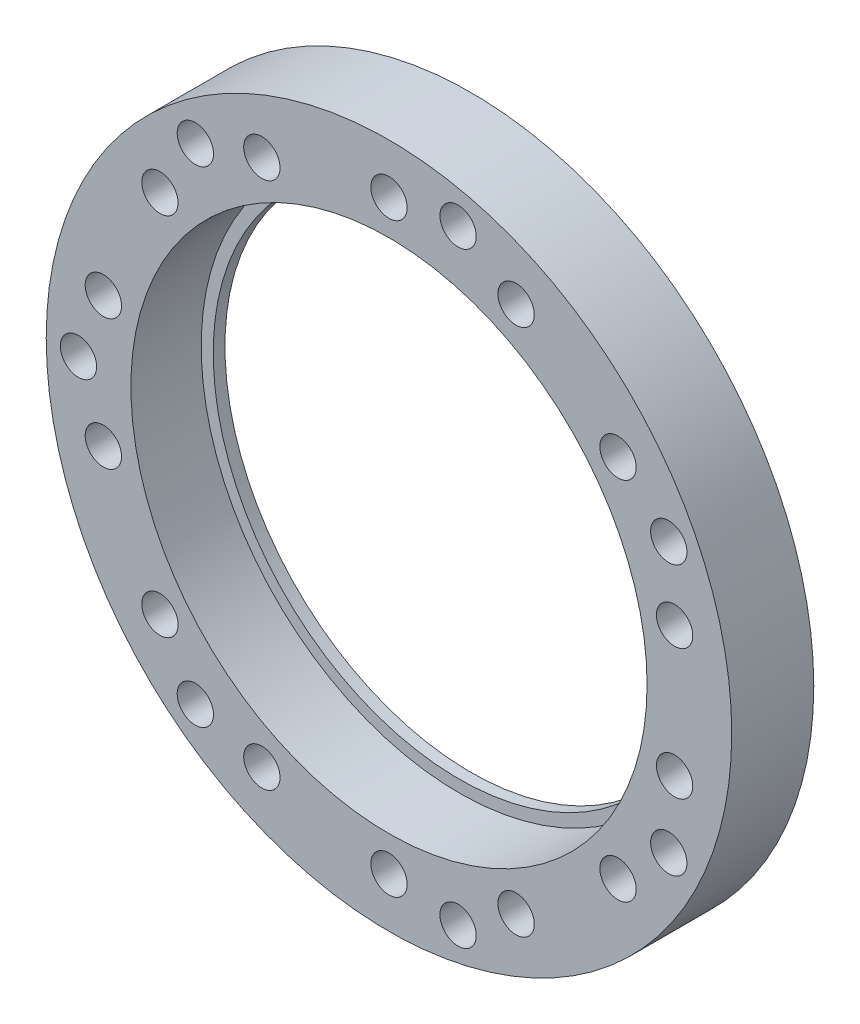
ISO-10303-21;
HEADER;
FILE_DESCRIPTION(('STEP AP214'),'2;1');
FILE_NAME('part.step','',(''),(''),'','','');
FILE_SCHEMA(('AUTOMOTIVE_DESIGN { 1 0 10303 214 1 1 1 1 }'));
ENDSEC;
DATA;
#1=APPLICATION_CONTEXT('core data for automotive mechanical design processes');
#2=APPLICATION_PROTOCOL_DEFINITION('international standard','automotive_design',2000,#1);
#3=PRODUCT_CONTEXT('',#1,'mechanical');
#4=PRODUCT('Part','Part','',(#3));
#5=PRODUCT_RELATED_PRODUCT_CATEGORY('part','',(#4));
#6=PRODUCT_DEFINITION_FORMATION('','',#4);
#7=PRODUCT_DEFINITION_CONTEXT('part definition',#1,'design');
#8=PRODUCT_DEFINITION('design','',#6,#7);
#9=PRODUCT_DEFINITION_SHAPE('','',#8);
#10=(LENGTH_UNIT() NAMED_UNIT(*) SI_UNIT(.MILLI.,.METRE.));
#11=(NAMED_UNIT(*) PLANE_ANGLE_UNIT() SI_UNIT($,.RADIAN.));
#12=(NAMED_UNIT(*) SI_UNIT($,.STERADIAN.) SOLID_ANGLE_UNIT());
#13=UNCERTAINTY_MEASURE_WITH_UNIT(LENGTH_MEASURE(1.E-05),#10,'distance_accuracy_value','');
#14=(GEOMETRIC_REPRESENTATION_CONTEXT(3) GLOBAL_UNCERTAINTY_ASSIGNED_CONTEXT((#13)) GLOBAL_UNIT_ASSIGNED_CONTEXT((#10,
#11,#12)) REPRESENTATION_CONTEXT('',''));
#15=CARTESIAN_POINT('',(0.,0.,0.));
#16=DIRECTION('',(0.,0.,1.));
#17=DIRECTION('',(1.,0.,0.));
#18=AXIS2_PLACEMENT_3D('',#15,#16,#17);
#19=CARTESIAN_POINT('',(0.,0.,7.));
#20=DIRECTION('',(0.,0.,-1.));
#21=DIRECTION('',(-1.,0.,0.));
#22=AXIS2_PLACEMENT_3D('',#19,#20,#21);
#23=CYLINDRICAL_SURFACE('',#22,29.25);
#24=CARTESIAN_POINT('',(0.,0.,7.));
#25=DIRECTION('',(0.,0.,1.));
#26=DIRECTION('',(1.,0.,0.));
#27=AXIS2_PLACEMENT_3D('',#24,#25,#26);
#28=CIRCLE('',#27,29.25);
#29=CARTESIAN_POINT('',(29.25,0.,7.));
#30=VERTEX_POINT('',#29);
#31=EDGE_CURVE('E57',#30,#30,#28,.T.);
#32=ORIENTED_EDGE('',*,*,#31,.F.);
#33=EDGE_LOOP('',(#32));
#34=FACE_BOUND('',#33,.T.);
#35=CARTESIAN_POINT('',(0.,0.,0.));
#36=DIRECTION('',(0.,0.,1.));
#37=DIRECTION('',(1.,0.,0.));
#38=AXIS2_PLACEMENT_3D('',#35,#36,#37);
#39=CIRCLE('',#38,29.25);
#40=CARTESIAN_POINT('',(29.25,0.,0.));
#41=VERTEX_POINT('',#40);
#42=EDGE_CURVE('E65',#41,#41,#39,.T.);
#43=ORIENTED_EDGE('',*,*,#42,.T.);
#44=EDGE_LOOP('',(#43));
#45=FACE_BOUND('',#44,.T.);
#46=ADVANCED_FACE('F43',(#34,#45),#23,.T.);
#47=CARTESIAN_POINT('',(0.,0.,7.));
#48=DIRECTION('',(0.,0.,-1.));
#49=DIRECTION('',(-1.,0.,0.));
#50=AXIS2_PLACEMENT_3D('',#47,#48,#49);
#51=CYLINDRICAL_SURFACE('',#50,22.025);
#52=CARTESIAN_POINT('',(0.,0.,1.));
#53=DIRECTION('',(0.,0.,1.));
#54=DIRECTION('',(1.,0.,0.));
#55=AXIS2_PLACEMENT_3D('',#52,#53,#54);
#56=CIRCLE('',#55,22.025);
#57=CARTESIAN_POINT('',(22.025,0.,1.));
#58=VERTEX_POINT('',#57);
#59=EDGE_CURVE('E10',#58,#58,#56,.T.);
#60=ORIENTED_EDGE('',*,*,#59,.F.);
#61=EDGE_LOOP('',(#60));
#62=FACE_BOUND('',#61,.T.);
#63=CARTESIAN_POINT('',(0.,0.,7.));
#64=DIRECTION('',(0.,0.,1.));
#65=DIRECTION('',(1.,0.,0.));
#66=AXIS2_PLACEMENT_3D('',#63,#64,#65);
#67=CIRCLE('',#66,22.025);
#68=CARTESIAN_POINT('',(22.025,0.,7.));
#69=VERTEX_POINT('',#68);
#70=EDGE_CURVE('E50',#69,#69,#67,.T.);
#71=ORIENTED_EDGE('',*,*,#70,.T.);
#72=EDGE_LOOP('',(#71));
#73=FACE_BOUND('',#72,.T.);
#74=ADVANCED_FACE('F264',(#62,#73),#51,.F.);
#75=CARTESIAN_POINT('',(0.,0.,7.));
#76=DIRECTION('',(0.,0.,1.));
#77=DIRECTION('',(1.,0.,0.));
#78=AXIS2_PLACEMENT_3D('',#75,#76,#77);
#79=PLANE('',#78);
#80=CARTESIAN_POINT('',(5.89680474984235,25.8355896728183,7.));
#81=DIRECTION('',(0.,0.,1.));
#82=DIRECTION('',(1.,0.,0.));
#83=AXIS2_PLACEMENT_3D('',#80,#81,#82);
#84=CIRCLE('',#83,1.55);
#85=CARTESIAN_POINT('',(7.44680474984235,25.8355896728183,7.));
#86=VERTEX_POINT('',#85);
#87=EDGE_CURVE('E203',#86,#86,#84,.T.);
#88=ORIENTED_EDGE('',*,*,#87,.F.);
#89=EDGE_LOOP('',(#88));
#90=FACE_BOUND('',#89,.T.);
#91=CARTESIAN_POINT('',(-16.5224797492562,20.7185342854018,7.));
#92=DIRECTION('',(0.,0.,1.));
#93=DIRECTION('',(1.,0.,0.));
#94=AXIS2_PLACEMENT_3D('',#91,#92,#93);
#95=CIRCLE('',#94,1.55);
#96=CARTESIAN_POINT('',(-14.9724797492562,20.7185342854018,7.));
#97=VERTEX_POINT('',#96);
#98=EDGE_CURVE('E228',#97,#97,#95,.T.);
#99=ORIENTED_EDGE('',*,*,#98,.F.);
#100=EDGE_LOOP('',(#99));
#101=FACE_BOUND('',#100,.T.);
#102=CARTESIAN_POINT('',(-26.4999999999989,-1.34180860866806E-12,7.));
#103=DIRECTION('',(0.,0.,1.));
#104=DIRECTION('',(1.,0.,0.));
#105=AXIS2_PLACEMENT_3D('',#102,#103,#104);
#106=CIRCLE('',#105,1.55);
#107=CARTESIAN_POINT('',(-24.9499999999989,-1.34180860866806E-12,7.));
#108=VERTEX_POINT('',#107);
#109=EDGE_CURVE('E220',#108,#108,#106,.T.);
#110=ORIENTED_EDGE('',*,*,#109,.F.);
#111=EDGE_LOOP('',(#110));
#112=FACE_BOUND('',#111,.T.);
#113=CARTESIAN_POINT('',(-16.5224797492544,-20.7185342854037,7.));
#114=DIRECTION('',(0.,0.,1.));
#115=DIRECTION('',(1.,0.,0.));
#116=AXIS2_PLACEMENT_3D('',#113,#114,#115);
#117=CIRCLE('',#116,1.55);
#118=CARTESIAN_POINT('',(-14.9724797492544,-20.7185342854037,7.));
#119=VERTEX_POINT('',#118);
#120=EDGE_CURVE('E211',#119,#119,#117,.T.);
#121=ORIENTED_EDGE('',*,*,#120,.F.);
#122=EDGE_LOOP('',(#121));
#123=FACE_BOUND('',#122,.T.);
#124=CARTESIAN_POINT('',(5.89680474984452,-25.8355896728183,7.));
#125=DIRECTION('',(0.,0.,1.));
#126=DIRECTION('',(1.,0.,0.));
#127=AXIS2_PLACEMENT_3D('',#124,#125,#126);
#128=CIRCLE('',#127,1.55);
#129=CARTESIAN_POINT('',(7.44680474984452,-25.8355896728183,7.));
#130=VERTEX_POINT('',#129);
#131=EDGE_CURVE('E212',#130,#130,#128,.T.);
#132=ORIENTED_EDGE('',*,*,#131,.F.);
#133=EDGE_LOOP('',(#132));
#134=FACE_BOUND('',#133,.T.);
#135=CARTESIAN_POINT('',(23.8756749994157,-11.4979190866145,7.));
#136=DIRECTION('',(0.,0.,1.));
#137=DIRECTION('',(1.,0.,0.));
#138=AXIS2_PLACEMENT_3D('',#135,#136,#137);
#139=CIRCLE('',#138,1.55);
#140=CARTESIAN_POINT('',(25.4256749994157,-11.4979190866145,7.));
#141=VERTEX_POINT('',#140);
#142=EDGE_CURVE('E243',#141,#141,#139,.T.);
#143=ORIENTED_EDGE('',*,*,#142,.F.);
#144=EDGE_LOOP('',(#143));
#145=FACE_BOUND('',#144,.T.);
#146=CARTESIAN_POINT('',(23.8756749994147,11.4979190866161,7.));
#147=DIRECTION('',(0.,0.,1.));
#148=DIRECTION('',(1.,0.,0.));
#149=AXIS2_PLACEMENT_3D('',#146,#147,#148);
#150=CIRCLE('',#149,1.55);
#151=CARTESIAN_POINT('',(25.4256749994147,11.4979190866161,7.));
#152=VERTEX_POINT('',#151);
#153=EDGE_CURVE('E195',#152,#152,#150,.T.);
#154=ORIENTED_EDGE('',*,*,#153,.F.);
#155=EDGE_LOOP('',(#154));
#156=FACE_BOUND('',#155,.T.);
#157=CARTESIAN_POINT('',(10.8470934779392,22.5242216975604,7.));
#158=DIRECTION('',(0.,0.,1.));
#159=DIRECTION('',(1.,0.,0.));
#160=AXIS2_PLACEMENT_3D('',#157,#158,#159);
#161=CIRCLE('',#160,1.55);
#162=CARTESIAN_POINT('',(12.3970934779392,22.5242216975604,7.));
#163=VERTEX_POINT('',#162);
#164=EDGE_CURVE('E144',#163,#163,#161,.T.);
#165=ORIENTED_EDGE('',*,*,#164,.F.);
#166=EDGE_LOOP('',(#165));
#167=FACE_BOUND('',#166,.T.);
#168=CARTESIAN_POINT('',(19.5457870617014,15.5872450464687,7.));
#169=DIRECTION('',(0.,0.,1.));
#170=DIRECTION('',(1.,0.,0.));
#171=AXIS2_PLACEMENT_3D('',#168,#169,#170);
#172=CIRCLE('',#171,1.55);
#173=CARTESIAN_POINT('',(21.0957870617014,15.5872450464687,7.));
#174=VERTEX_POINT('',#173);
#175=EDGE_CURVE('E136',#174,#174,#172,.T.);
#176=ORIENTED_EDGE('',*,*,#175,.F.);
#177=EDGE_LOOP('',(#176));
#178=FACE_BOUND('',#177,.T.);
#179=CARTESIAN_POINT('',(24.3731978045465,5.56302334890829,7.));
#180=DIRECTION('',(0.,0.,1.));
#181=DIRECTION('',(1.,0.,0.));
#182=AXIS2_PLACEMENT_3D('',#179,#180,#181);
#183=CIRCLE('',#182,1.55);
#184=CARTESIAN_POINT('',(25.9231978045465,5.56302334890829,7.));
#185=VERTEX_POINT('',#184);
#186=EDGE_CURVE('E128',#185,#185,#183,.T.);
#187=ORIENTED_EDGE('',*,*,#186,.F.);
#188=EDGE_LOOP('',(#187));
#189=FACE_BOUND('',#188,.T.);
#190=CARTESIAN_POINT('',(24.3731978045468,-5.5630233489075,7.));
#191=DIRECTION('',(0.,0.,1.));
#192=DIRECTION('',(1.,0.,0.));
#193=AXIS2_PLACEMENT_3D('',#190,#191,#192);
#194=CIRCLE('',#193,1.55);
#195=CARTESIAN_POINT('',(25.9231978045468,-5.5630233489075,7.));
#196=VERTEX_POINT('',#195);
#197=EDGE_CURVE('E120',#196,#196,#194,.T.);
#198=ORIENTED_EDGE('',*,*,#197,.F.);
#199=EDGE_LOOP('',(#198));
#200=FACE_BOUND('',#199,.T.);
#201=CARTESIAN_POINT('',(19.5457870617021,-15.5872450464682,7.));
#202=DIRECTION('',(0.,0.,1.));
#203=DIRECTION('',(1.,0.,0.));
#204=AXIS2_PLACEMENT_3D('',#201,#202,#203);
#205=CIRCLE('',#204,1.55);
#206=CARTESIAN_POINT('',(21.0957870617021,-15.5872450464682,7.));
#207=VERTEX_POINT('',#206);
#208=EDGE_CURVE('E112',#207,#207,#205,.T.);
#209=ORIENTED_EDGE('',*,*,#208,.F.);
#210=EDGE_LOOP('',(#209));
#211=FACE_BOUND('',#210,.T.);
#212=CARTESIAN_POINT('',(10.8470934779405,-22.5242216975606,7.));
#213=DIRECTION('',(0.,0.,1.));
#214=DIRECTION('',(1.,0.,0.));
#215=AXIS2_PLACEMENT_3D('',#212,#213,#214);
#216=CIRCLE('',#215,1.55);
#217=CARTESIAN_POINT('',(12.3970934779405,-22.5242216975606,7.));
#218=VERTEX_POINT('',#217);
#219=EDGE_CURVE('E104',#218,#218,#216,.T.);
#220=ORIENTED_EDGE('',*,*,#219,.F.);
#221=EDGE_LOOP('',(#220));
#222=FACE_BOUND('',#221,.T.);
#223=CARTESIAN_POINT('',(1.51614831800373E-12,-25.0000000000004,7.));
#224=DIRECTION('',(0.,0.,1.));
#225=DIRECTION('',(1.,0.,0.));
#226=AXIS2_PLACEMENT_3D('',#223,#224,#225);
#227=CIRCLE('',#226,1.55);
#228=CARTESIAN_POINT('',(1.55000000000152,-25.0000000000004,7.));
#229=VERTEX_POINT('',#228);
#230=EDGE_CURVE('E96',#229,#229,#227,.T.);
#231=ORIENTED_EDGE('',*,*,#230,.F.);
#232=EDGE_LOOP('',(#231));
#233=FACE_BOUND('',#232,.T.);
#234=CARTESIAN_POINT('',(-10.8470934779375,-22.5242216975612,7.));
#235=DIRECTION('',(0.,0.,1.));
#236=DIRECTION('',(1.,0.,0.));
#237=AXIS2_PLACEMENT_3D('',#234,#235,#236);
#238=CIRCLE('',#237,1.55);
#239=CARTESIAN_POINT('',(-9.29709347793754,-22.5242216975612,7.));
#240=VERTEX_POINT('',#239);
#241=EDGE_CURVE('E87',#240,#240,#238,.T.);
#242=ORIENTED_EDGE('',*,*,#241,.F.);
#243=EDGE_LOOP('',(#242));
#244=FACE_BOUND('',#243,.T.);
#245=CARTESIAN_POINT('',(-19.5457870616993,-15.5872450464695,7.));
#246=DIRECTION('',(0.,0.,1.));
#247=DIRECTION('',(1.,0.,0.));
#248=AXIS2_PLACEMENT_3D('',#245,#246,#247);
#249=CIRCLE('',#248,1.55);
#250=CARTESIAN_POINT('',(-17.9957870616993,-15.5872450464695,7.));
#251=VERTEX_POINT('',#250);
#252=EDGE_CURVE('E184',#251,#251,#249,.T.);
#253=ORIENTED_EDGE('',*,*,#252,.F.);
#254=EDGE_LOOP('',(#253));
#255=FACE_BOUND('',#254,.T.);
#256=CARTESIAN_POINT('',(-24.3731978045445,-5.56302334890922,7.));
#257=DIRECTION('',(0.,0.,1.));
#258=DIRECTION('',(1.,0.,0.));
#259=AXIS2_PLACEMENT_3D('',#256,#257,#258);
#260=CIRCLE('',#259,1.55);
#261=CARTESIAN_POINT('',(-22.8231978045445,-5.56302334890922,7.));
#262=VERTEX_POINT('',#261);
#263=EDGE_CURVE('E176',#262,#262,#260,.T.);
#264=ORIENTED_EDGE('',*,*,#263,.F.);
#265=EDGE_LOOP('',(#264));
#266=FACE_BOUND('',#265,.T.);
#267=CARTESIAN_POINT('',(-24.3731978045449,5.56302334890648,7.));
#268=DIRECTION('',(0.,0.,1.));
#269=DIRECTION('',(1.,0.,0.));
#270=AXIS2_PLACEMENT_3D('',#267,#268,#269);
#271=CIRCLE('',#270,1.55);
#272=CARTESIAN_POINT('',(-22.8231978045449,5.56302334890648,7.));
#273=VERTEX_POINT('',#272);
#274=EDGE_CURVE('E168',#273,#273,#271,.T.);
#275=ORIENTED_EDGE('',*,*,#274,.F.);
#276=EDGE_LOOP('',(#275));
#277=FACE_BOUND('',#276,.T.);
#278=CARTESIAN_POINT('',(-19.5457870617004,15.5872450464671,7.));
#279=DIRECTION('',(0.,0.,1.));
#280=DIRECTION('',(1.,0.,0.));
#281=AXIS2_PLACEMENT_3D('',#278,#279,#280);
#282=CIRCLE('',#281,1.55);
#283=CARTESIAN_POINT('',(-17.9957870617004,15.5872450464671,7.));
#284=VERTEX_POINT('',#283);
#285=EDGE_CURVE('E160',#284,#284,#282,.T.);
#286=ORIENTED_EDGE('',*,*,#285,.F.);
#287=EDGE_LOOP('',(#286));
#288=FACE_BOUND('',#287,.T.);
#289=CARTESIAN_POINT('',(-10.8470934779388,22.5242216975595,7.));
#290=DIRECTION('',(0.,0.,1.));
#291=DIRECTION('',(1.,0.,0.));
#292=AXIS2_PLACEMENT_3D('',#289,#290,#291);
#293=CIRCLE('',#292,1.55);
#294=CARTESIAN_POINT('',(-9.29709347793884,22.5242216975595,7.));
#295=VERTEX_POINT('',#294);
#296=EDGE_CURVE('E151',#295,#295,#293,.T.);
#297=ORIENTED_EDGE('',*,*,#296,.F.);
#298=EDGE_LOOP('',(#297));
#299=FACE_BOUND('',#298,.T.);
#300=CARTESIAN_POINT('',(0.,25.,7.));
#301=DIRECTION('',(0.,0.,1.));
#302=DIRECTION('',(1.,0.,0.));
#303=AXIS2_PLACEMENT_3D('',#300,#301,#302);
#304=CIRCLE('',#303,1.55);
#305=CARTESIAN_POINT('',(1.55,25.,7.));
#306=VERTEX_POINT('',#305);
#307=EDGE_CURVE('E77',#306,#306,#304,.T.);
#308=ORIENTED_EDGE('',*,*,#307,.F.);
#309=EDGE_LOOP('',(#308));
#310=FACE_BOUND('',#309,.T.);
#311=ORIENTED_EDGE('',*,*,#31,.T.);
#312=EDGE_LOOP('',(#311));
#313=FACE_BOUND('',#312,.T.);
#314=ORIENTED_EDGE('',*,*,#70,.F.);
#315=EDGE_LOOP('',(#314));
#316=FACE_BOUND('',#315,.T.);
#317=ADVANCED_FACE('F260',(#90,#101,#112,#123,#134,#145,#156,#167,#178,#189,#200,#211,#222,#233,
#244,#255,#266,#277,#288,#299,#310,#313,#316),#79,.T.);
#318=CARTESIAN_POINT('',(0.,0.,0.));
#319=DIRECTION('',(0.,0.,1.));
#320=DIRECTION('',(1.,0.,0.));
#321=AXIS2_PLACEMENT_3D('',#318,#319,#320);
#322=PLANE('',#321);
#323=CARTESIAN_POINT('',(5.89680474984235,25.8355896728183,0.));
#324=DIRECTION('',(0.,0.,1.));
#325=DIRECTION('',(1.,0.,0.));
#326=AXIS2_PLACEMENT_3D('',#323,#324,#325);
#327=CIRCLE('',#326,1.55);
#328=CARTESIAN_POINT('',(7.44680474984235,25.8355896728183,0.));
#329=VERTEX_POINT('',#328);
#330=EDGE_CURVE('E232',#329,#329,#327,.T.);
#331=ORIENTED_EDGE('',*,*,#330,.T.);
#332=EDGE_LOOP('',(#331));
#333=FACE_BOUND('',#332,.T.);
#334=CARTESIAN_POINT('',(-16.5224797492562,20.7185342854018,0.));
#335=DIRECTION('',(0.,0.,1.));
#336=DIRECTION('',(1.,0.,0.));
#337=AXIS2_PLACEMENT_3D('',#334,#335,#336);
#338=CIRCLE('',#337,1.55);
#339=CARTESIAN_POINT('',(-14.9724797492562,20.7185342854018,0.));
#340=VERTEX_POINT('',#339);
#341=EDGE_CURVE('E224',#340,#340,#338,.T.);
#342=ORIENTED_EDGE('',*,*,#341,.T.);
#343=EDGE_LOOP('',(#342));
#344=FACE_BOUND('',#343,.T.);
#345=CARTESIAN_POINT('',(-26.4999999999989,-1.34180860866806E-12,0.));
#346=DIRECTION('',(0.,0.,1.));
#347=DIRECTION('',(1.,0.,0.));
#348=AXIS2_PLACEMENT_3D('',#345,#346,#347);
#349=CIRCLE('',#348,1.55);
#350=CARTESIAN_POINT('',(-24.9499999999989,-1.34180860866806E-12,0.));
#351=VERTEX_POINT('',#350);
#352=EDGE_CURVE('E216',#351,#351,#349,.T.);
#353=ORIENTED_EDGE('',*,*,#352,.T.);
#354=EDGE_LOOP('',(#353));
#355=FACE_BOUND('',#354,.T.);
#356=CARTESIAN_POINT('',(-16.5224797492544,-20.7185342854037,0.));
#357=DIRECTION('',(0.,0.,1.));
#358=DIRECTION('',(1.,0.,0.));
#359=AXIS2_PLACEMENT_3D('',#356,#357,#358);
#360=CIRCLE('',#359,1.55);
#361=CARTESIAN_POINT('',(-14.9724797492544,-20.7185342854037,0.));
#362=VERTEX_POINT('',#361);
#363=EDGE_CURVE('E207',#362,#362,#360,.T.);
#364=ORIENTED_EDGE('',*,*,#363,.T.);
#365=EDGE_LOOP('',(#364));
#366=FACE_BOUND('',#365,.T.);
#367=CARTESIAN_POINT('',(5.89680474984452,-25.8355896728183,0.));
#368=DIRECTION('',(0.,0.,1.));
#369=DIRECTION('',(1.,0.,0.));
#370=AXIS2_PLACEMENT_3D('',#367,#368,#369);
#371=CIRCLE('',#370,1.55);
#372=CARTESIAN_POINT('',(7.44680474984452,-25.8355896728183,0.));
#373=VERTEX_POINT('',#372);
#374=EDGE_CURVE('E247',#373,#373,#371,.T.);
#375=ORIENTED_EDGE('',*,*,#374,.T.);
#376=EDGE_LOOP('',(#375));
#377=FACE_BOUND('',#376,.T.);
#378=CARTESIAN_POINT('',(23.8756749994157,-11.4979190866145,0.));
#379=DIRECTION('',(0.,0.,1.));
#380=DIRECTION('',(1.,0.,0.));
#381=AXIS2_PLACEMENT_3D('',#378,#379,#380);
#382=CIRCLE('',#381,1.55);
#383=CARTESIAN_POINT('',(25.4256749994157,-11.4979190866145,0.));
#384=VERTEX_POINT('',#383);
#385=EDGE_CURVE('E239',#384,#384,#382,.T.);
#386=ORIENTED_EDGE('',*,*,#385,.T.);
#387=EDGE_LOOP('',(#386));
#388=FACE_BOUND('',#387,.T.);
#389=CARTESIAN_POINT('',(23.8756749994147,11.4979190866161,0.));
#390=DIRECTION('',(0.,0.,1.));
#391=DIRECTION('',(1.,0.,0.));
#392=AXIS2_PLACEMENT_3D('',#389,#390,#391);
#393=CIRCLE('',#392,1.55);
#394=CARTESIAN_POINT('',(25.4256749994147,11.4979190866161,0.));
#395=VERTEX_POINT('',#394);
#396=EDGE_CURVE('E199',#395,#395,#393,.T.);
#397=ORIENTED_EDGE('',*,*,#396,.T.);
#398=EDGE_LOOP('',(#397));
#399=FACE_BOUND('',#398,.T.);
#400=ORIENTED_EDGE('',*,*,#42,.F.);
#401=EDGE_LOOP('',(#400));
#402=FACE_BOUND('',#401,.T.);
#403=CARTESIAN_POINT('',(0.,0.,0.));
#404=DIRECTION('',(0.,0.,1.));
#405=DIRECTION('',(1.,0.,0.));
#406=AXIS2_PLACEMENT_3D('',#403,#404,#405);
#407=CIRCLE('',#406,21.);
#408=CARTESIAN_POINT('',(21.,0.,0.));
#409=VERTEX_POINT('',#408);
#410=EDGE_CURVE('E191',#409,#409,#407,.T.);
#411=ORIENTED_EDGE('',*,*,#410,.T.);
#412=EDGE_LOOP('',(#411));
#413=FACE_BOUND('',#412,.T.);
#414=ADVANCED_FACE('F263',(#333,#344,#355,#366,#377,#388,#399,#402,#413),#322,.F.);
#415=CARTESIAN_POINT('',(0.,25.,3.));
#416=DIRECTION('',(0.,0.,1.));
#417=DIRECTION('',(1.,0.,0.));
#418=AXIS2_PLACEMENT_3D('',#415,#416,#417);
#419=CYLINDRICAL_SURFACE('',#418,1.55);
#420=CARTESIAN_POINT('',(0.,25.,3.));
#421=DIRECTION('',(0.,0.,1.));
#422=DIRECTION('',(1.,0.,0.));
#423=AXIS2_PLACEMENT_3D('',#420,#421,#422);
#424=CIRCLE('',#423,1.55);
#425=CARTESIAN_POINT('',(1.55,25.,3.));
#426=VERTEX_POINT('',#425);
#427=EDGE_CURVE('E70',#426,#426,#424,.T.);
#428=ORIENTED_EDGE('',*,*,#427,.F.);
#429=EDGE_LOOP('',(#428));
#430=FACE_BOUND('',#429,.T.);
#431=ORIENTED_EDGE('',*,*,#307,.T.);
#432=EDGE_LOOP('',(#431));
#433=FACE_BOUND('',#432,.T.);
#434=ADVANCED_FACE('F311',(#430,#433),#419,.F.);
#435=CARTESIAN_POINT('',(0.,25.,3.));
#436=DIRECTION('',(0.,0.,1.));
#437=DIRECTION('',(1.,0.,0.));
#438=AXIS2_PLACEMENT_3D('',#435,#436,#437);
#439=PLANE('',#438);
#440=ORIENTED_EDGE('',*,*,#427,.T.);
#441=EDGE_LOOP('',(#440));
#442=FACE_BOUND('',#441,.T.);
#443=ADVANCED_FACE('F316',(#442),#439,.T.);
#444=CARTESIAN_POINT('',(-10.8470934779388,22.5242216975595,3.));
#445=DIRECTION('',(0.,0.,1.));
#446=DIRECTION('',(1.,0.,0.));
#447=AXIS2_PLACEMENT_3D('',#444,#445,#446);
#448=CYLINDRICAL_SURFACE('',#447,1.55);
#449=CARTESIAN_POINT('',(-10.8470934779388,22.5242216975595,3.));
#450=DIRECTION('',(0.,0.,1.));
#451=DIRECTION('',(1.,0.,0.));
#452=AXIS2_PLACEMENT_3D('',#449,#450,#451);
#453=CIRCLE('',#452,1.55);
#454=CARTESIAN_POINT('',(-9.29709347793884,22.5242216975595,3.));
#455=VERTEX_POINT('',#454);
#456=EDGE_CURVE('E155',#455,#455,#453,.T.);
#457=ORIENTED_EDGE('',*,*,#456,.F.);
#458=EDGE_LOOP('',(#457));
#459=FACE_BOUND('',#458,.T.);
#460=ORIENTED_EDGE('',*,*,#296,.T.);
#461=EDGE_LOOP('',(#460));
#462=FACE_BOUND('',#461,.T.);
#463=ADVANCED_FACE('F320',(#459,#462),#448,.F.);
#464=CARTESIAN_POINT('',(-10.8470934779388,22.5242216975595,3.));
#465=DIRECTION('',(0.,0.,1.));
#466=DIRECTION('',(1.,0.,0.));
#467=AXIS2_PLACEMENT_3D('',#464,#465,#466);
#468=PLANE('',#467);
#469=ORIENTED_EDGE('',*,*,#456,.T.);
#470=EDGE_LOOP('',(#469));
#471=FACE_BOUND('',#470,.T.);
#472=ADVANCED_FACE('F389',(#471),#468,.T.);
#473=CARTESIAN_POINT('',(-19.5457870617004,15.5872450464671,3.));
#474=DIRECTION('',(0.,0.,1.));
#475=DIRECTION('',(1.,0.,0.));
#476=AXIS2_PLACEMENT_3D('',#473,#474,#475);
#477=CYLINDRICAL_SURFACE('',#476,1.55);
#478=CARTESIAN_POINT('',(-19.5457870617004,15.5872450464671,3.));
#479=DIRECTION('',(0.,0.,1.));
#480=DIRECTION('',(1.,0.,0.));
#481=AXIS2_PLACEMENT_3D('',#478,#479,#480);
#482=CIRCLE('',#481,1.55);
#483=CARTESIAN_POINT('',(-17.9957870617004,15.5872450464671,3.));
#484=VERTEX_POINT('',#483);
#485=EDGE_CURVE('E164',#484,#484,#482,.T.);
#486=ORIENTED_EDGE('',*,*,#485,.F.);
#487=EDGE_LOOP('',(#486));
#488=FACE_BOUND('',#487,.T.);
#489=ORIENTED_EDGE('',*,*,#285,.T.);
#490=EDGE_LOOP('',(#489));
#491=FACE_BOUND('',#490,.T.);
#492=ADVANCED_FACE('F393',(#488,#491),#477,.F.);
#493=CARTESIAN_POINT('',(-19.5457870617004,15.5872450464671,3.));
#494=DIRECTION('',(0.,0.,1.));
#495=DIRECTION('',(1.,0.,0.));
#496=AXIS2_PLACEMENT_3D('',#493,#494,#495);
#497=PLANE('',#496);
#498=ORIENTED_EDGE('',*,*,#485,.T.);
#499=EDGE_LOOP('',(#498));
#500=FACE_BOUND('',#499,.T.);
#501=ADVANCED_FACE('F397',(#500),#497,.T.);
#502=CARTESIAN_POINT('',(-24.3731978045449,5.56302334890648,3.));
#503=DIRECTION('',(0.,0.,1.));
#504=DIRECTION('',(1.,0.,0.));
#505=AXIS2_PLACEMENT_3D('',#502,#503,#504);
#506=CYLINDRICAL_SURFACE('',#505,1.55);
#507=CARTESIAN_POINT('',(-24.3731978045449,5.56302334890648,3.));
#508=DIRECTION('',(0.,0.,1.));
#509=DIRECTION('',(1.,0.,0.));
#510=AXIS2_PLACEMENT_3D('',#507,#508,#509);
#511=CIRCLE('',#510,1.55);
#512=CARTESIAN_POINT('',(-22.8231978045449,5.56302334890648,3.));
#513=VERTEX_POINT('',#512);
#514=EDGE_CURVE('E172',#513,#513,#511,.T.);
#515=ORIENTED_EDGE('',*,*,#514,.F.);
#516=EDGE_LOOP('',(#515));
#517=FACE_BOUND('',#516,.T.);
#518=ORIENTED_EDGE('',*,*,#274,.T.);
#519=EDGE_LOOP('',(#518));
#520=FACE_BOUND('',#519,.T.);
#521=ADVANCED_FACE('F401',(#517,#520),#506,.F.);
#522=CARTESIAN_POINT('',(-24.3731978045449,5.56302334890648,3.));
#523=DIRECTION('',(0.,0.,1.));
#524=DIRECTION('',(1.,0.,0.));
#525=AXIS2_PLACEMENT_3D('',#522,#523,#524);
#526=PLANE('',#525);
#527=ORIENTED_EDGE('',*,*,#514,.T.);
#528=EDGE_LOOP('',(#527));
#529=FACE_BOUND('',#528,.T.);
#530=ADVANCED_FACE('F405',(#529),#526,.T.);
#531=CARTESIAN_POINT('',(-24.3731978045445,-5.56302334890922,3.));
#532=DIRECTION('',(0.,0.,1.));
#533=DIRECTION('',(1.,0.,0.));
#534=AXIS2_PLACEMENT_3D('',#531,#532,#533);
#535=CYLINDRICAL_SURFACE('',#534,1.55);
#536=CARTESIAN_POINT('',(-24.3731978045445,-5.56302334890922,3.));
#537=DIRECTION('',(0.,0.,1.));
#538=DIRECTION('',(1.,0.,0.));
#539=AXIS2_PLACEMENT_3D('',#536,#537,#538);
#540=CIRCLE('',#539,1.55);
#541=CARTESIAN_POINT('',(-22.8231978045445,-5.56302334890922,3.));
#542=VERTEX_POINT('',#541);
#543=EDGE_CURVE('E180',#542,#542,#540,.T.);
#544=ORIENTED_EDGE('',*,*,#543,.F.);
#545=EDGE_LOOP('',(#544));
#546=FACE_BOUND('',#545,.T.);
#547=ORIENTED_EDGE('',*,*,#263,.T.);
#548=EDGE_LOOP('',(#547));
#549=FACE_BOUND('',#548,.T.);
#550=ADVANCED_FACE('F409',(#546,#549),#535,.F.);
#551=CARTESIAN_POINT('',(-24.3731978045445,-5.56302334890922,3.));
#552=DIRECTION('',(0.,0.,1.));
#553=DIRECTION('',(1.,0.,0.));
#554=AXIS2_PLACEMENT_3D('',#551,#552,#553);
#555=PLANE('',#554);
#556=ORIENTED_EDGE('',*,*,#543,.T.);
#557=EDGE_LOOP('',(#556));
#558=FACE_BOUND('',#557,.T.);
#559=ADVANCED_FACE('F413',(#558),#555,.T.);
#560=CARTESIAN_POINT('',(-19.5457870616993,-15.5872450464695,3.));
#561=DIRECTION('',(0.,0.,1.));
#562=DIRECTION('',(1.,0.,0.));
#563=AXIS2_PLACEMENT_3D('',#560,#561,#562);
#564=CYLINDRICAL_SURFACE('',#563,1.55);
#565=CARTESIAN_POINT('',(-19.5457870616993,-15.5872450464695,3.));
#566=DIRECTION('',(0.,0.,1.));
#567=DIRECTION('',(1.,0.,0.));
#568=AXIS2_PLACEMENT_3D('',#565,#566,#567);
#569=CIRCLE('',#568,1.55);
#570=CARTESIAN_POINT('',(-17.9957870616993,-15.5872450464695,3.));
#571=VERTEX_POINT('',#570);
#572=EDGE_CURVE('E92',#571,#571,#569,.T.);
#573=ORIENTED_EDGE('',*,*,#572,.F.);
#574=EDGE_LOOP('',(#573));
#575=FACE_BOUND('',#574,.T.);
#576=ORIENTED_EDGE('',*,*,#252,.T.);
#577=EDGE_LOOP('',(#576));
#578=FACE_BOUND('',#577,.T.);
#579=ADVANCED_FACE('F417',(#575,#578),#564,.F.);
#580=CARTESIAN_POINT('',(-19.5457870616993,-15.5872450464695,3.));
#581=DIRECTION('',(0.,0.,1.));
#582=DIRECTION('',(1.,0.,0.));
#583=AXIS2_PLACEMENT_3D('',#580,#581,#582);
#584=PLANE('',#583);
#585=ORIENTED_EDGE('',*,*,#572,.T.);
#586=EDGE_LOOP('',(#585));
#587=FACE_BOUND('',#586,.T.);
#588=ADVANCED_FACE('F325',(#587),#584,.T.);
#589=CARTESIAN_POINT('',(-10.8470934779375,-22.5242216975612,3.));
#590=DIRECTION('',(0.,0.,1.));
#591=DIRECTION('',(1.,0.,0.));
#592=AXIS2_PLACEMENT_3D('',#589,#590,#591);
#593=CYLINDRICAL_SURFACE('',#592,1.55);
#594=CARTESIAN_POINT('',(-10.8470934779375,-22.5242216975612,3.));
#595=DIRECTION('',(0.,0.,1.));
#596=DIRECTION('',(1.,0.,0.));
#597=AXIS2_PLACEMENT_3D('',#594,#595,#596);
#598=CIRCLE('',#597,1.55);
#599=CARTESIAN_POINT('',(-9.29709347793754,-22.5242216975612,3.));
#600=VERTEX_POINT('',#599);
#601=EDGE_CURVE('E91',#600,#600,#598,.T.);
#602=ORIENTED_EDGE('',*,*,#601,.F.);
#603=EDGE_LOOP('',(#602));
#604=FACE_BOUND('',#603,.T.);
#605=ORIENTED_EDGE('',*,*,#241,.T.);
#606=EDGE_LOOP('',(#605));
#607=FACE_BOUND('',#606,.T.);
#608=ADVANCED_FACE('F321',(#604,#607),#593,.F.);
#609=CARTESIAN_POINT('',(-10.8470934779375,-22.5242216975612,3.));
#610=DIRECTION('',(0.,0.,1.));
#611=DIRECTION('',(1.,0.,0.));
#612=AXIS2_PLACEMENT_3D('',#609,#610,#611);
#613=PLANE('',#612);
#614=ORIENTED_EDGE('',*,*,#601,.T.);
#615=EDGE_LOOP('',(#614));
#616=FACE_BOUND('',#615,.T.);
#617=ADVANCED_FACE('F324',(#616),#613,.T.);
#618=CARTESIAN_POINT('',(1.51614831800373E-12,-25.0000000000004,3.));
#619=DIRECTION('',(0.,0.,1.));
#620=DIRECTION('',(1.,0.,0.));
#621=AXIS2_PLACEMENT_3D('',#618,#619,#620);
#622=CYLINDRICAL_SURFACE('',#621,1.55);
#623=CARTESIAN_POINT('',(1.51614831800373E-12,-25.0000000000004,3.));
#624=DIRECTION('',(0.,0.,1.));
#625=DIRECTION('',(1.,0.,0.));
#626=AXIS2_PLACEMENT_3D('',#623,#624,#625);
#627=CIRCLE('',#626,1.55);
#628=CARTESIAN_POINT('',(1.55000000000152,-25.0000000000004,3.));
#629=VERTEX_POINT('',#628);
#630=EDGE_CURVE('E100',#629,#629,#627,.T.);
#631=ORIENTED_EDGE('',*,*,#630,.F.);
#632=EDGE_LOOP('',(#631));
#633=FACE_BOUND('',#632,.T.);
#634=ORIENTED_EDGE('',*,*,#230,.T.);
#635=EDGE_LOOP('',(#634));
#636=FACE_BOUND('',#635,.T.);
#637=ADVANCED_FACE('F329',(#633,#636),#622,.F.);
#638=CARTESIAN_POINT('',(1.51614831800373E-12,-25.0000000000004,3.));
#639=DIRECTION('',(0.,0.,1.));
#640=DIRECTION('',(1.,0.,0.));
#641=AXIS2_PLACEMENT_3D('',#638,#639,#640);
#642=PLANE('',#641);
#643=ORIENTED_EDGE('',*,*,#630,.T.);
#644=EDGE_LOOP('',(#643));
#645=FACE_BOUND('',#644,.T.);
#646=ADVANCED_FACE('F333',(#645),#642,.T.);
#647=CARTESIAN_POINT('',(10.8470934779405,-22.5242216975606,3.));
#648=DIRECTION('',(0.,0.,1.));
#649=DIRECTION('',(1.,0.,0.));
#650=AXIS2_PLACEMENT_3D('',#647,#648,#649);
#651=CYLINDRICAL_SURFACE('',#650,1.55);
#652=CARTESIAN_POINT('',(10.8470934779405,-22.5242216975606,3.));
#653=DIRECTION('',(0.,0.,1.));
#654=DIRECTION('',(1.,0.,0.));
#655=AXIS2_PLACEMENT_3D('',#652,#653,#654);
#656=CIRCLE('',#655,1.55);
#657=CARTESIAN_POINT('',(12.3970934779405,-22.5242216975606,3.));
#658=VERTEX_POINT('',#657);
#659=EDGE_CURVE('E108',#658,#658,#656,.T.);
#660=ORIENTED_EDGE('',*,*,#659,.F.);
#661=EDGE_LOOP('',(#660));
#662=FACE_BOUND('',#661,.T.);
#663=ORIENTED_EDGE('',*,*,#219,.T.);
#664=EDGE_LOOP('',(#663));
#665=FACE_BOUND('',#664,.T.);
#666=ADVANCED_FACE('F337',(#662,#665),#651,.F.);
#667=CARTESIAN_POINT('',(10.8470934779405,-22.5242216975606,3.));
#668=DIRECTION('',(0.,0.,1.));
#669=DIRECTION('',(1.,0.,0.));
#670=AXIS2_PLACEMENT_3D('',#667,#668,#669);
#671=PLANE('',#670);
#672=ORIENTED_EDGE('',*,*,#659,.T.);
#673=EDGE_LOOP('',(#672));
#674=FACE_BOUND('',#673,.T.);
#675=ADVANCED_FACE('F341',(#674),#671,.T.);
#676=CARTESIAN_POINT('',(19.5457870617021,-15.5872450464682,3.));
#677=DIRECTION('',(0.,0.,1.));
#678=DIRECTION('',(1.,0.,0.));
#679=AXIS2_PLACEMENT_3D('',#676,#677,#678);
#680=CYLINDRICAL_SURFACE('',#679,1.55);
#681=CARTESIAN_POINT('',(19.5457870617021,-15.5872450464682,3.));
#682=DIRECTION('',(0.,0.,1.));
#683=DIRECTION('',(1.,0.,0.));
#684=AXIS2_PLACEMENT_3D('',#681,#682,#683);
#685=CIRCLE('',#684,1.55);
#686=CARTESIAN_POINT('',(21.0957870617021,-15.5872450464682,3.));
#687=VERTEX_POINT('',#686);
#688=EDGE_CURVE('E116',#687,#687,#685,.T.);
#689=ORIENTED_EDGE('',*,*,#688,.F.);
#690=EDGE_LOOP('',(#689));
#691=FACE_BOUND('',#690,.T.);
#692=ORIENTED_EDGE('',*,*,#208,.T.);
#693=EDGE_LOOP('',(#692));
#694=FACE_BOUND('',#693,.T.);
#695=ADVANCED_FACE('F345',(#691,#694),#680,.F.);
#696=CARTESIAN_POINT('',(19.5457870617021,-15.5872450464682,3.));
#697=DIRECTION('',(0.,0.,1.));
#698=DIRECTION('',(1.,0.,0.));
#699=AXIS2_PLACEMENT_3D('',#696,#697,#698);
#700=PLANE('',#699);
#701=ORIENTED_EDGE('',*,*,#688,.T.);
#702=EDGE_LOOP('',(#701));
#703=FACE_BOUND('',#702,.T.);
#704=ADVANCED_FACE('F349',(#703),#700,.T.);
#705=CARTESIAN_POINT('',(24.3731978045468,-5.5630233489075,3.));
#706=DIRECTION('',(0.,0.,1.));
#707=DIRECTION('',(1.,0.,0.));
#708=AXIS2_PLACEMENT_3D('',#705,#706,#707);
#709=CYLINDRICAL_SURFACE('',#708,1.55);
#710=CARTESIAN_POINT('',(24.3731978045468,-5.5630233489075,3.));
#711=DIRECTION('',(0.,0.,1.));
#712=DIRECTION('',(1.,0.,0.));
#713=AXIS2_PLACEMENT_3D('',#710,#711,#712);
#714=CIRCLE('',#713,1.55);
#715=CARTESIAN_POINT('',(25.9231978045468,-5.5630233489075,3.));
#716=VERTEX_POINT('',#715);
#717=EDGE_CURVE('E124',#716,#716,#714,.T.);
#718=ORIENTED_EDGE('',*,*,#717,.F.);
#719=EDGE_LOOP('',(#718));
#720=FACE_BOUND('',#719,.T.);
#721=ORIENTED_EDGE('',*,*,#197,.T.);
#722=EDGE_LOOP('',(#721));
#723=FACE_BOUND('',#722,.T.);
#724=ADVANCED_FACE('F353',(#720,#723),#709,.F.);
#725=CARTESIAN_POINT('',(24.3731978045468,-5.5630233489075,3.));
#726=DIRECTION('',(0.,0.,1.));
#727=DIRECTION('',(1.,0.,0.));
#728=AXIS2_PLACEMENT_3D('',#725,#726,#727);
#729=PLANE('',#728);
#730=ORIENTED_EDGE('',*,*,#717,.T.);
#731=EDGE_LOOP('',(#730));
#732=FACE_BOUND('',#731,.T.);
#733=ADVANCED_FACE('F357',(#732),#729,.T.);
#734=CARTESIAN_POINT('',(24.3731978045465,5.56302334890829,3.));
#735=DIRECTION('',(0.,0.,1.));
#736=DIRECTION('',(1.,0.,0.));
#737=AXIS2_PLACEMENT_3D('',#734,#735,#736);
#738=CYLINDRICAL_SURFACE('',#737,1.55);
#739=CARTESIAN_POINT('',(24.3731978045465,5.56302334890829,3.));
#740=DIRECTION('',(0.,0.,1.));
#741=DIRECTION('',(1.,0.,0.));
#742=AXIS2_PLACEMENT_3D('',#739,#740,#741);
#743=CIRCLE('',#742,1.55);
#744=CARTESIAN_POINT('',(25.9231978045465,5.56302334890829,3.));
#745=VERTEX_POINT('',#744);
#746=EDGE_CURVE('E132',#745,#745,#743,.T.);
#747=ORIENTED_EDGE('',*,*,#746,.F.);
#748=EDGE_LOOP('',(#747));
#749=FACE_BOUND('',#748,.T.);
#750=ORIENTED_EDGE('',*,*,#186,.T.);
#751=EDGE_LOOP('',(#750));
#752=FACE_BOUND('',#751,.T.);
#753=ADVANCED_FACE('F361',(#749,#752),#738,.F.);
#754=CARTESIAN_POINT('',(24.3731978045465,5.56302334890829,3.));
#755=DIRECTION('',(0.,0.,1.));
#756=DIRECTION('',(1.,0.,0.));
#757=AXIS2_PLACEMENT_3D('',#754,#755,#756);
#758=PLANE('',#757);
#759=ORIENTED_EDGE('',*,*,#746,.T.);
#760=EDGE_LOOP('',(#759));
#761=FACE_BOUND('',#760,.T.);
#762=ADVANCED_FACE('F365',(#761),#758,.T.);
#763=CARTESIAN_POINT('',(19.5457870617014,15.5872450464687,3.));
#764=DIRECTION('',(0.,0.,1.));
#765=DIRECTION('',(1.,0.,0.));
#766=AXIS2_PLACEMENT_3D('',#763,#764,#765);
#767=CYLINDRICAL_SURFACE('',#766,1.55);
#768=CARTESIAN_POINT('',(19.5457870617014,15.5872450464687,3.));
#769=DIRECTION('',(0.,0.,1.));
#770=DIRECTION('',(1.,0.,0.));
#771=AXIS2_PLACEMENT_3D('',#768,#769,#770);
#772=CIRCLE('',#771,1.55);
#773=CARTESIAN_POINT('',(21.0957870617014,15.5872450464687,3.));
#774=VERTEX_POINT('',#773);
#775=EDGE_CURVE('E140',#774,#774,#772,.T.);
#776=ORIENTED_EDGE('',*,*,#775,.F.);
#777=EDGE_LOOP('',(#776));
#778=FACE_BOUND('',#777,.T.);
#779=ORIENTED_EDGE('',*,*,#175,.T.);
#780=EDGE_LOOP('',(#779));
#781=FACE_BOUND('',#780,.T.);
#782=ADVANCED_FACE('F369',(#778,#781),#767,.F.);
#783=CARTESIAN_POINT('',(19.5457870617014,15.5872450464687,3.));
#784=DIRECTION('',(0.,0.,1.));
#785=DIRECTION('',(1.,0.,0.));
#786=AXIS2_PLACEMENT_3D('',#783,#784,#785);
#787=PLANE('',#786);
#788=ORIENTED_EDGE('',*,*,#775,.T.);
#789=EDGE_LOOP('',(#788));
#790=FACE_BOUND('',#789,.T.);
#791=ADVANCED_FACE('F373',(#790),#787,.T.);
#792=CARTESIAN_POINT('',(10.8470934779392,22.5242216975604,3.));
#793=DIRECTION('',(0.,0.,1.));
#794=DIRECTION('',(1.,0.,0.));
#795=AXIS2_PLACEMENT_3D('',#792,#793,#794);
#796=CYLINDRICAL_SURFACE('',#795,1.55);
#797=CARTESIAN_POINT('',(10.8470934779392,22.5242216975604,3.));
#798=DIRECTION('',(0.,0.,1.));
#799=DIRECTION('',(1.,0.,0.));
#800=AXIS2_PLACEMENT_3D('',#797,#798,#799);
#801=CIRCLE('',#800,1.55);
#802=CARTESIAN_POINT('',(12.3970934779392,22.5242216975604,3.));
#803=VERTEX_POINT('',#802);
#804=EDGE_CURVE('E85',#803,#803,#801,.T.);
#805=ORIENTED_EDGE('',*,*,#804,.F.);
#806=EDGE_LOOP('',(#805));
#807=FACE_BOUND('',#806,.T.);
#808=ORIENTED_EDGE('',*,*,#164,.T.);
#809=EDGE_LOOP('',(#808));
#810=FACE_BOUND('',#809,.T.);
#811=ADVANCED_FACE('F377',(#807,#810),#796,.F.);
#812=CARTESIAN_POINT('',(10.8470934779392,22.5242216975604,3.));
#813=DIRECTION('',(0.,0.,1.));
#814=DIRECTION('',(1.,0.,0.));
#815=AXIS2_PLACEMENT_3D('',#812,#813,#814);
#816=PLANE('',#815);
#817=ORIENTED_EDGE('',*,*,#804,.T.);
#818=EDGE_LOOP('',(#817));
#819=FACE_BOUND('',#818,.T.);
#820=ADVANCED_FACE('F381',(#819),#816,.T.);
#821=CARTESIAN_POINT('',(0.,0.,1.));
#822=DIRECTION('',(0.,0.,1.));
#823=DIRECTION('',(1.,0.,0.));
#824=AXIS2_PLACEMENT_3D('',#821,#822,#823);
#825=PLANE('',#824);
#826=CARTESIAN_POINT('',(0.,0.,1.));
#827=DIRECTION('',(0.,0.,1.));
#828=DIRECTION('',(1.,0.,0.));
#829=AXIS2_PLACEMENT_3D('',#826,#827,#828);
#830=CIRCLE('',#829,21.);
#831=CARTESIAN_POINT('',(21.,0.,1.));
#832=VERTEX_POINT('',#831);
#833=EDGE_CURVE('E156',#832,#832,#830,.T.);
#834=ORIENTED_EDGE('',*,*,#833,.F.);
#835=EDGE_LOOP('',(#834));
#836=FACE_BOUND('',#835,.T.);
#837=ORIENTED_EDGE('',*,*,#59,.T.);
#838=EDGE_LOOP('',(#837));
#839=FACE_BOUND('',#838,.T.);
#840=ADVANCED_FACE('F385',(#836,#839),#825,.T.);
#841=CARTESIAN_POINT('',(0.,0.,1.));
#842=DIRECTION('',(0.,0.,-1.));
#843=DIRECTION('',(-1.,0.,0.));
#844=AXIS2_PLACEMENT_3D('',#841,#842,#843);
#845=CYLINDRICAL_SURFACE('',#844,21.);
#846=ORIENTED_EDGE('',*,*,#833,.T.);
#847=EDGE_LOOP('',(#846));
#848=FACE_BOUND('',#847,.T.);
#849=ORIENTED_EDGE('',*,*,#410,.F.);
#850=EDGE_LOOP('',(#849));
#851=FACE_BOUND('',#850,.T.);
#852=ADVANCED_FACE('F427',(#848,#851),#845,.F.);
#853=CARTESIAN_POINT('',(23.8756749994147,11.4979190866161,7.));
#854=DIRECTION('',(0.,0.,-1.));
#855=DIRECTION('',(-1.,0.,0.));
#856=AXIS2_PLACEMENT_3D('',#853,#854,#855);
#857=CYLINDRICAL_SURFACE('',#856,1.55);
#858=ORIENTED_EDGE('',*,*,#153,.T.);
#859=EDGE_LOOP('',(#858));
#860=FACE_BOUND('',#859,.T.);
#861=ORIENTED_EDGE('',*,*,#396,.F.);
#862=EDGE_LOOP('',(#861));
#863=FACE_BOUND('',#862,.T.);
#864=ADVANCED_FACE('F431',(#860,#863),#857,.F.);
#865=CARTESIAN_POINT('',(23.8756749994157,-11.4979190866145,7.));
#866=DIRECTION('',(0.,0.,-1.));
#867=DIRECTION('',(-1.,0.,0.));
#868=AXIS2_PLACEMENT_3D('',#865,#866,#867);
#869=CYLINDRICAL_SURFACE('',#868,1.55);
#870=ORIENTED_EDGE('',*,*,#142,.T.);
#871=EDGE_LOOP('',(#870));
#872=FACE_BOUND('',#871,.T.);
#873=ORIENTED_EDGE('',*,*,#385,.F.);
#874=EDGE_LOOP('',(#873));
#875=FACE_BOUND('',#874,.T.);
#876=ADVANCED_FACE('F435',(#872,#875),#869,.F.);
#877=CARTESIAN_POINT('',(5.89680474984452,-25.8355896728183,7.));
#878=DIRECTION('',(0.,0.,-1.));
#879=DIRECTION('',(-1.,0.,0.));
#880=AXIS2_PLACEMENT_3D('',#877,#878,#879);
#881=CYLINDRICAL_SURFACE('',#880,1.55);
#882=ORIENTED_EDGE('',*,*,#131,.T.);
#883=EDGE_LOOP('',(#882));
#884=FACE_BOUND('',#883,.T.);
#885=ORIENTED_EDGE('',*,*,#374,.F.);
#886=EDGE_LOOP('',(#885));
#887=FACE_BOUND('',#886,.T.);
#888=ADVANCED_FACE('F257',(#884,#887),#881,.F.);
#889=CARTESIAN_POINT('',(-16.5224797492544,-20.7185342854037,7.));
#890=DIRECTION('',(0.,0.,-1.));
#891=DIRECTION('',(-1.,0.,0.));
#892=AXIS2_PLACEMENT_3D('',#889,#890,#891);
#893=CYLINDRICAL_SURFACE('',#892,1.55);
#894=ORIENTED_EDGE('',*,*,#120,.T.);
#895=EDGE_LOOP('',(#894));
#896=FACE_BOUND('',#895,.T.);
#897=ORIENTED_EDGE('',*,*,#363,.F.);
#898=EDGE_LOOP('',(#897));
#899=FACE_BOUND('',#898,.T.);
#900=ADVANCED_FACE('F437',(#896,#899),#893,.F.);
#901=CARTESIAN_POINT('',(-26.4999999999989,-1.34180860866806E-12,7.));
#902=DIRECTION('',(0.,0.,-1.));
#903=DIRECTION('',(-1.,0.,0.));
#904=AXIS2_PLACEMENT_3D('',#901,#902,#903);
#905=CYLINDRICAL_SURFACE('',#904,1.55);
#906=ORIENTED_EDGE('',*,*,#109,.T.);
#907=EDGE_LOOP('',(#906));
#908=FACE_BOUND('',#907,.T.);
#909=ORIENTED_EDGE('',*,*,#352,.F.);
#910=EDGE_LOOP('',(#909));
#911=FACE_BOUND('',#910,.T.);
#912=ADVANCED_FACE('F440',(#908,#911),#905,.F.);
#913=CARTESIAN_POINT('',(-16.5224797492562,20.7185342854018,7.));
#914=DIRECTION('',(0.,0.,-1.));
#915=DIRECTION('',(-1.,0.,0.));
#916=AXIS2_PLACEMENT_3D('',#913,#914,#915);
#917=CYLINDRICAL_SURFACE('',#916,1.55);
#918=ORIENTED_EDGE('',*,*,#98,.T.);
#919=EDGE_LOOP('',(#918));
#920=FACE_BOUND('',#919,.T.);
#921=ORIENTED_EDGE('',*,*,#341,.F.);
#922=EDGE_LOOP('',(#921));
#923=FACE_BOUND('',#922,.T.);
#924=ADVANCED_FACE('F444',(#920,#923),#917,.F.);
#925=CARTESIAN_POINT('',(5.89680474984235,25.8355896728183,7.));
#926=DIRECTION('',(0.,0.,-1.));
#927=DIRECTION('',(-1.,0.,0.));
#928=AXIS2_PLACEMENT_3D('',#925,#926,#927);
#929=CYLINDRICAL_SURFACE('',#928,1.55);
#930=ORIENTED_EDGE('',*,*,#87,.T.);
#931=EDGE_LOOP('',(#930));
#932=FACE_BOUND('',#931,.T.);
#933=ORIENTED_EDGE('',*,*,#330,.F.);
#934=EDGE_LOOP('',(#933));
#935=FACE_BOUND('',#934,.T.);
#936=ADVANCED_FACE('F448',(#932,#935),#929,.F.);
#937=CLOSED_SHELL('',(#46,#74,#317,#414,#434,#443,#463,#472,#492,#501,#521,#530,#550,#559,#579,
#588,#608,#617,#637,#646,#666,#675,#695,#704,#724,#733,#753,#762,#782,#791,#811,#820,#840,#852,
#864,#876,#888,#900,#912,#924,#936));
#938=MANIFOLD_SOLID_BREP('B2',#937);
#939=ADVANCED_BREP_SHAPE_REPRESENTATION('',(#18,#938),#14);
#940=SHAPE_DEFINITION_REPRESENTATION(#9,#939);
ENDSEC;
END-ISO-10303-21;
